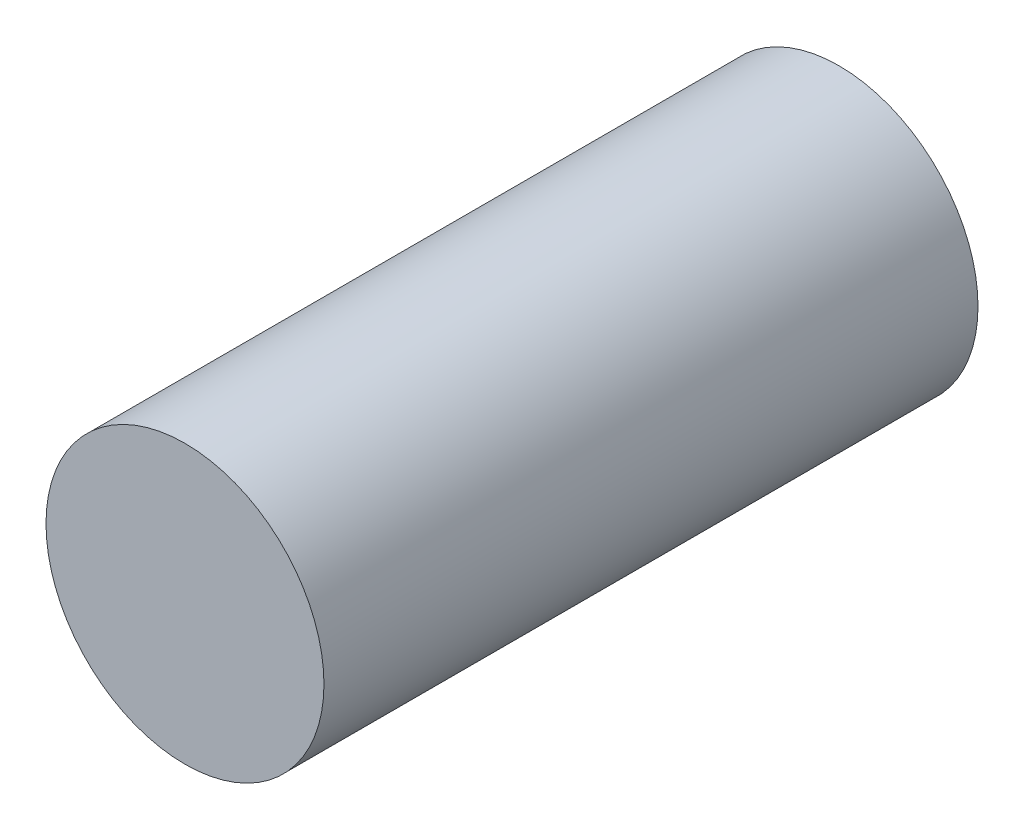
ISO-10303-21;
HEADER;
FILE_DESCRIPTION(('STEP AP214'),'2;1');
FILE_NAME('part.step','',(''),(''),'','','');
FILE_SCHEMA(('AUTOMOTIVE_DESIGN { 1 0 10303 214 1 1 1 1 }'));
ENDSEC;
DATA;
#1=APPLICATION_CONTEXT('core data for automotive mechanical design processes');
#2=APPLICATION_PROTOCOL_DEFINITION('international standard','automotive_design',2000,#1);
#3=PRODUCT_CONTEXT('',#1,'mechanical');
#4=PRODUCT('Part','Part','',(#3));
#5=PRODUCT_RELATED_PRODUCT_CATEGORY('part','',(#4));
#6=PRODUCT_DEFINITION_FORMATION('','',#4);
#7=PRODUCT_DEFINITION_CONTEXT('part definition',#1,'design');
#8=PRODUCT_DEFINITION('design','',#6,#7);
#9=PRODUCT_DEFINITION_SHAPE('','',#8);
#10=(LENGTH_UNIT() NAMED_UNIT(*) SI_UNIT(.MILLI.,.METRE.));
#11=(NAMED_UNIT(*) PLANE_ANGLE_UNIT() SI_UNIT($,.RADIAN.));
#12=(NAMED_UNIT(*) SI_UNIT($,.STERADIAN.) SOLID_ANGLE_UNIT());
#13=UNCERTAINTY_MEASURE_WITH_UNIT(LENGTH_MEASURE(1.E-05),#10,'distance_accuracy_value','');
#14=(GEOMETRIC_REPRESENTATION_CONTEXT(3) GLOBAL_UNCERTAINTY_ASSIGNED_CONTEXT((#13)) GLOBAL_UNIT_ASSIGNED_CONTEXT((#10,
#11,#12)) REPRESENTATION_CONTEXT('',''));
#15=CARTESIAN_POINT('',(0.,0.,0.));
#16=DIRECTION('',(0.,0.,1.));
#17=DIRECTION('',(1.,0.,0.));
#18=AXIS2_PLACEMENT_3D('',#15,#16,#17);
#19=CARTESIAN_POINT('',(-56.348854120069,15.3745515296843,-5.80832611218032));
#20=DIRECTION('',(0.,0.,1.));
#21=DIRECTION('',(1.,0.,0.));
#22=AXIS2_PLACEMENT_3D('',#19,#20,#21);
#23=CYLINDRICAL_SURFACE('',#22,1.7);
#24=CARTESIAN_POINT('',(-56.348854120069,15.3745515296843,-1.0000000001118));
#25=DIRECTION('',(0.,0.,1.));
#26=DIRECTION('',(1.,0.,0.));
#27=AXIS2_PLACEMENT_3D('',#24,#25,#26);
#28=CIRCLE('',#27,1.7);
#29=CARTESIAN_POINT('',(-54.648854120069,15.3745515296843,-1.0000000001118));
#30=VERTEX_POINT('',#29);
#31=EDGE_CURVE('E10',#30,#30,#28,.F.);
#32=ORIENTED_EDGE('',*,*,#31,.F.);
#33=EDGE_LOOP('',(#32));
#34=FACE_BOUND('',#33,.T.);
#35=CARTESIAN_POINT('',(-56.348854120069,15.3745515296843,7.));
#36=DIRECTION('',(0.,0.,1.));
#37=DIRECTION('',(1.,0.,0.));
#38=AXIS2_PLACEMENT_3D('',#35,#36,#37);
#39=CIRCLE('',#38,1.7);
#40=CARTESIAN_POINT('',(-54.648854120069,15.3745515296843,7.));
#41=VERTEX_POINT('',#40);
#42=EDGE_CURVE('E45',#41,#41,#39,.T.);
#43=ORIENTED_EDGE('',*,*,#42,.F.);
#44=EDGE_LOOP('',(#43));
#45=FACE_BOUND('',#44,.T.);
#46=ADVANCED_FACE('F39',(#34,#45),#23,.T.);
#47=CARTESIAN_POINT('',(-21.3488541200689,6.37455152968434,-1.0000000001118));
#48=DIRECTION('',(0.,0.,1.));
#49=DIRECTION('',(-1.,0.,0.));
#50=AXIS2_PLACEMENT_3D('',#47,#48,#49);
#51=PLANE('',#50);
#52=ORIENTED_EDGE('',*,*,#31,.T.);
#53=EDGE_LOOP('',(#52));
#54=FACE_BOUND('',#53,.T.);
#55=ADVANCED_FACE('F54',(#54),#51,.F.);
#56=CARTESIAN_POINT('',(-56.348854120069,15.3745515296843,7.));
#57=DIRECTION('',(0.,0.,1.));
#58=DIRECTION('',(1.,0.,0.));
#59=AXIS2_PLACEMENT_3D('',#56,#57,#58);
#60=PLANE('',#59);
#61=ORIENTED_EDGE('',*,*,#42,.T.);
#62=EDGE_LOOP('',(#61));
#63=FACE_BOUND('',#62,.T.);
#64=ADVANCED_FACE('F51',(#63),#60,.T.);
#65=CLOSED_SHELL('',(#46,#55,#64));
#66=MANIFOLD_SOLID_BREP('B2',#65);
#67=ADVANCED_BREP_SHAPE_REPRESENTATION('',(#18,#66),#14);
#68=SHAPE_DEFINITION_REPRESENTATION(#9,#67);
ENDSEC;
END-ISO-10303-21;
